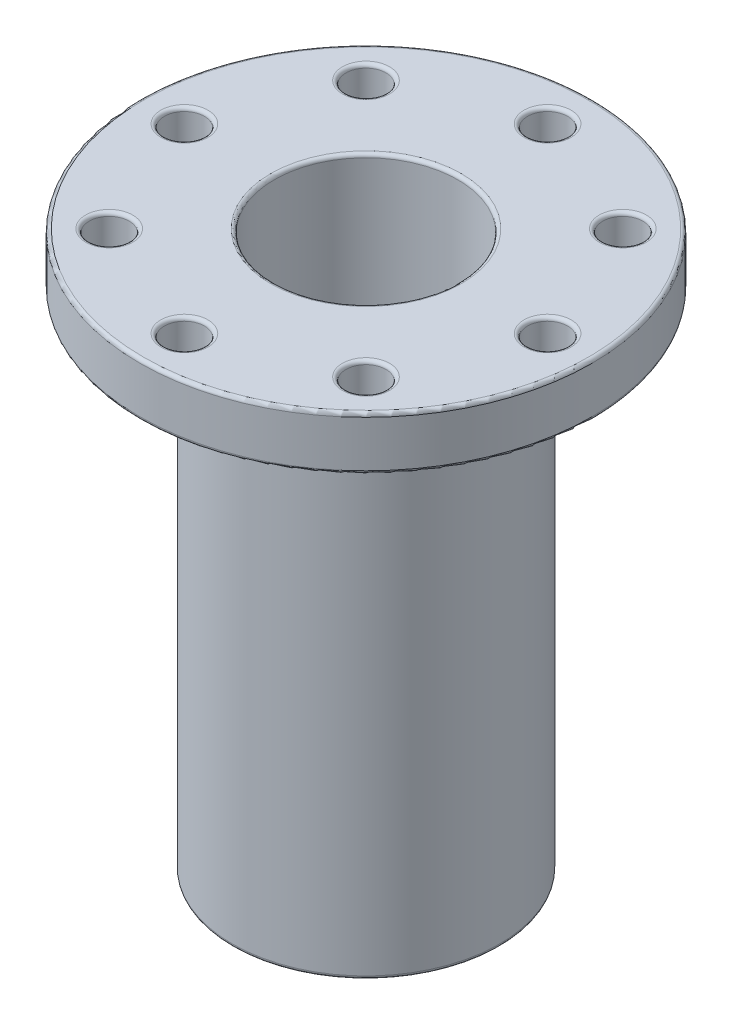
ISO-10303-21;
HEADER;
FILE_DESCRIPTION(('STEP AP214'),'2;1');
FILE_NAME('part.step','',(''),(''),'','','');
FILE_SCHEMA(('AUTOMOTIVE_DESIGN { 1 0 10303 214 1 1 1 1 }'));
ENDSEC;
DATA;
#1=APPLICATION_CONTEXT('core data for automotive mechanical design processes');
#2=APPLICATION_PROTOCOL_DEFINITION('international standard','automotive_design',2000,#1);
#3=PRODUCT_CONTEXT('',#1,'mechanical');
#4=PRODUCT('Part','Part','',(#3));
#5=PRODUCT_RELATED_PRODUCT_CATEGORY('part','',(#4));
#6=PRODUCT_DEFINITION_FORMATION('','',#4);
#7=PRODUCT_DEFINITION_CONTEXT('part definition',#1,'design');
#8=PRODUCT_DEFINITION('design','',#6,#7);
#9=PRODUCT_DEFINITION_SHAPE('','',#8);
#10=(LENGTH_UNIT() NAMED_UNIT(*) SI_UNIT(.MILLI.,.METRE.));
#11=(NAMED_UNIT(*) PLANE_ANGLE_UNIT() SI_UNIT($,.RADIAN.));
#12=(NAMED_UNIT(*) SI_UNIT($,.STERADIAN.) SOLID_ANGLE_UNIT());
#13=UNCERTAINTY_MEASURE_WITH_UNIT(LENGTH_MEASURE(1.E-05),#10,'distance_accuracy_value','');
#14=(GEOMETRIC_REPRESENTATION_CONTEXT(3) GLOBAL_UNCERTAINTY_ASSIGNED_CONTEXT((#13)) GLOBAL_UNIT_ASSIGNED_CONTEXT((#10,
#11,#12)) REPRESENTATION_CONTEXT('',''));
#15=CARTESIAN_POINT('',(0.,0.,0.));
#16=DIRECTION('',(0.,0.,1.));
#17=DIRECTION('',(1.,0.,0.));
#18=AXIS2_PLACEMENT_3D('',#15,#16,#17);
#19=CARTESIAN_POINT('',(0.,6.,0.));
#20=DIRECTION('',(0.,1.,0.));
#21=DIRECTION('',(0.,0.,1.));
#22=AXIS2_PLACEMENT_3D('',#19,#20,#21);
#23=PLANE('',#22);
#24=CARTESIAN_POINT('',(-14.4249783362056,6.,-14.4249783362056));
#25=DIRECTION('',(0.,1.,0.));
#26=DIRECTION('',(0.,0.,1.));
#27=AXIS2_PLACEMENT_3D('',#24,#25,#26);
#28=CIRCLE('',#27,2.65);
#29=CARTESIAN_POINT('',(-14.4249783362056,6.,-11.7749783362056));
#30=VERTEX_POINT('',#29);
#31=EDGE_CURVE('E155',#30,#30,#28,.F.);
#32=ORIENTED_EDGE('',*,*,#31,.T.);
#33=EDGE_LOOP('',(#32));
#34=FACE_BOUND('',#33,.T.);
#35=CARTESIAN_POINT('',(-14.4249783362056,6.,14.4249783362056));
#36=DIRECTION('',(0.,1.,0.));
#37=DIRECTION('',(0.,0.,1.));
#38=AXIS2_PLACEMENT_3D('',#35,#36,#37);
#39=CIRCLE('',#38,2.65);
#40=CARTESIAN_POINT('',(-14.4249783362056,6.,17.0749783362056));
#41=VERTEX_POINT('',#40);
#42=EDGE_CURVE('E158',#41,#41,#39,.F.);
#43=ORIENTED_EDGE('',*,*,#42,.T.);
#44=EDGE_LOOP('',(#43));
#45=FACE_BOUND('',#44,.T.);
#46=CARTESIAN_POINT('',(14.4249783362056,6.,14.4249783362056));
#47=DIRECTION('',(0.,1.,0.));
#48=DIRECTION('',(0.,0.,1.));
#49=AXIS2_PLACEMENT_3D('',#46,#47,#48);
#50=CIRCLE('',#49,2.65);
#51=CARTESIAN_POINT('',(14.4249783362056,6.,17.0749783362056));
#52=VERTEX_POINT('',#51);
#53=EDGE_CURVE('E161',#52,#52,#50,.F.);
#54=ORIENTED_EDGE('',*,*,#53,.T.);
#55=EDGE_LOOP('',(#54));
#56=FACE_BOUND('',#55,.T.);
#57=CARTESIAN_POINT('',(14.4249783362056,6.,-14.4249783362056));
#58=DIRECTION('',(0.,1.,0.));
#59=DIRECTION('',(0.,0.,1.));
#60=AXIS2_PLACEMENT_3D('',#57,#58,#59);
#61=CIRCLE('',#60,2.65);
#62=CARTESIAN_POINT('',(14.4249783362056,6.,-11.7749783362056));
#63=VERTEX_POINT('',#62);
#64=EDGE_CURVE('E164',#63,#63,#61,.F.);
#65=ORIENTED_EDGE('',*,*,#64,.T.);
#66=EDGE_LOOP('',(#65));
#67=FACE_BOUND('',#66,.T.);
#68=CARTESIAN_POINT('',(0.,6.,0.));
#69=DIRECTION('',(0.,1.,0.));
#70=DIRECTION('',(0.,0.,1.));
#71=AXIS2_PLACEMENT_3D('',#68,#69,#70);
#72=CIRCLE('',#71,25.);
#73=CARTESIAN_POINT('',(0.,6.,25.));
#74=VERTEX_POINT('',#73);
#75=EDGE_CURVE('E167',#74,#74,#72,.T.);
#76=ORIENTED_EDGE('',*,*,#75,.T.);
#77=EDGE_LOOP('',(#76));
#78=FACE_BOUND('',#77,.T.);
#79=CARTESIAN_POINT('',(0.,6.,-20.4));
#80=DIRECTION('',(0.,1.,0.));
#81=DIRECTION('',(0.,0.,1.));
#82=AXIS2_PLACEMENT_3D('',#79,#80,#81);
#83=CIRCLE('',#82,2.65);
#84=CARTESIAN_POINT('',(0.,6.,-17.75));
#85=VERTEX_POINT('',#84);
#86=EDGE_CURVE('E170',#85,#85,#83,.F.);
#87=ORIENTED_EDGE('',*,*,#86,.T.);
#88=EDGE_LOOP('',(#87));
#89=FACE_BOUND('',#88,.T.);
#90=CARTESIAN_POINT('',(20.4,6.,0.));
#91=DIRECTION('',(0.,1.,0.));
#92=DIRECTION('',(0.,0.,1.));
#93=AXIS2_PLACEMENT_3D('',#90,#91,#92);
#94=CIRCLE('',#93,2.65);
#95=CARTESIAN_POINT('',(20.4,6.,2.65));
#96=VERTEX_POINT('',#95);
#97=EDGE_CURVE('E173',#96,#96,#94,.F.);
#98=ORIENTED_EDGE('',*,*,#97,.T.);
#99=EDGE_LOOP('',(#98));
#100=FACE_BOUND('',#99,.T.);
#101=CARTESIAN_POINT('',(0.,6.,20.4));
#102=DIRECTION('',(0.,1.,0.));
#103=DIRECTION('',(0.,0.,1.));
#104=AXIS2_PLACEMENT_3D('',#101,#102,#103);
#105=CIRCLE('',#104,2.65);
#106=CARTESIAN_POINT('',(0.,6.,23.05));
#107=VERTEX_POINT('',#106);
#108=EDGE_CURVE('E176',#107,#107,#105,.F.);
#109=ORIENTED_EDGE('',*,*,#108,.T.);
#110=EDGE_LOOP('',(#109));
#111=FACE_BOUND('',#110,.T.);
#112=CARTESIAN_POINT('',(-20.4,6.,0.));
#113=DIRECTION('',(0.,1.,0.));
#114=DIRECTION('',(0.,0.,1.));
#115=AXIS2_PLACEMENT_3D('',#112,#113,#114);
#116=CIRCLE('',#115,2.65);
#117=CARTESIAN_POINT('',(-20.4,6.,2.65));
#118=VERTEX_POINT('',#117);
#119=EDGE_CURVE('E179',#118,#118,#116,.F.);
#120=ORIENTED_EDGE('',*,*,#119,.T.);
#121=EDGE_LOOP('',(#120));
#122=FACE_BOUND('',#121,.T.);
#123=CARTESIAN_POINT('',(0.,6.,0.));
#124=DIRECTION('',(0.,1.,0.));
#125=DIRECTION('',(0.,0.,1.));
#126=AXIS2_PLACEMENT_3D('',#123,#124,#125);
#127=CIRCLE('',#126,10.7125);
#128=CARTESIAN_POINT('',(0.,6.,10.7125));
#129=VERTEX_POINT('',#128);
#130=EDGE_CURVE('E182',#129,#129,#127,.F.);
#131=ORIENTED_EDGE('',*,*,#130,.T.);
#132=EDGE_LOOP('',(#131));
#133=FACE_BOUND('',#132,.T.);
#134=ADVANCED_FACE('F39',(#34,#45,#56,#67,#78,#89,#100,#111,#122,#133),#23,.T.);
#135=CARTESIAN_POINT('',(0.,0.,0.));
#136=DIRECTION('',(0.,1.,0.));
#137=DIRECTION('',(0.,0.,1.));
#138=AXIS2_PLACEMENT_3D('',#135,#136,#137);
#139=PLANE('',#138);
#140=CARTESIAN_POINT('',(-14.4249783362056,0.,-14.4249783362056));
#141=DIRECTION('',(0.,1.,0.));
#142=DIRECTION('',(0.,0.,1.));
#143=AXIS2_PLACEMENT_3D('',#140,#141,#142);
#144=CIRCLE('',#143,2.65);
#145=CARTESIAN_POINT('',(-14.4249783362056,0.,-11.7749783362056));
#146=VERTEX_POINT('',#145);
#147=EDGE_CURVE('E77',#146,#146,#144,.T.);
#148=ORIENTED_EDGE('',*,*,#147,.T.);
#149=EDGE_LOOP('',(#148));
#150=FACE_BOUND('',#149,.T.);
#151=CARTESIAN_POINT('',(-20.4,0.,0.));
#152=DIRECTION('',(0.,1.,0.));
#153=DIRECTION('',(0.,0.,1.));
#154=AXIS2_PLACEMENT_3D('',#151,#152,#153);
#155=CIRCLE('',#154,2.65);
#156=CARTESIAN_POINT('',(-20.4,0.,2.65));
#157=VERTEX_POINT('',#156);
#158=EDGE_CURVE('E80',#157,#157,#155,.T.);
#159=ORIENTED_EDGE('',*,*,#158,.T.);
#160=EDGE_LOOP('',(#159));
#161=FACE_BOUND('',#160,.T.);
#162=CARTESIAN_POINT('',(-14.4249783362056,0.,14.4249783362056));
#163=DIRECTION('',(0.,1.,0.));
#164=DIRECTION('',(0.,0.,1.));
#165=AXIS2_PLACEMENT_3D('',#162,#163,#164);
#166=CIRCLE('',#165,2.65);
#167=CARTESIAN_POINT('',(-14.4249783362056,0.,17.0749783362056));
#168=VERTEX_POINT('',#167);
#169=EDGE_CURVE('E83',#168,#168,#166,.T.);
#170=ORIENTED_EDGE('',*,*,#169,.T.);
#171=EDGE_LOOP('',(#170));
#172=FACE_BOUND('',#171,.T.);
#173=CARTESIAN_POINT('',(0.,0.,20.4));
#174=DIRECTION('',(0.,1.,0.));
#175=DIRECTION('',(0.,0.,1.));
#176=AXIS2_PLACEMENT_3D('',#173,#174,#175);
#177=CIRCLE('',#176,2.65);
#178=CARTESIAN_POINT('',(0.,0.,23.05));
#179=VERTEX_POINT('',#178);
#180=EDGE_CURVE('E86',#179,#179,#177,.T.);
#181=ORIENTED_EDGE('',*,*,#180,.T.);
#182=EDGE_LOOP('',(#181));
#183=FACE_BOUND('',#182,.T.);
#184=CARTESIAN_POINT('',(14.4249783362056,0.,14.4249783362056));
#185=DIRECTION('',(0.,1.,0.));
#186=DIRECTION('',(0.,0.,1.));
#187=AXIS2_PLACEMENT_3D('',#184,#185,#186);
#188=CIRCLE('',#187,2.65);
#189=CARTESIAN_POINT('',(14.4249783362056,0.,17.0749783362056));
#190=VERTEX_POINT('',#189);
#191=EDGE_CURVE('E89',#190,#190,#188,.T.);
#192=ORIENTED_EDGE('',*,*,#191,.T.);
#193=EDGE_LOOP('',(#192));
#194=FACE_BOUND('',#193,.T.);
#195=CARTESIAN_POINT('',(20.4,0.,0.));
#196=DIRECTION('',(0.,1.,0.));
#197=DIRECTION('',(0.,0.,1.));
#198=AXIS2_PLACEMENT_3D('',#195,#196,#197);
#199=CIRCLE('',#198,2.65);
#200=CARTESIAN_POINT('',(20.4,0.,2.65));
#201=VERTEX_POINT('',#200);
#202=EDGE_CURVE('E92',#201,#201,#199,.T.);
#203=ORIENTED_EDGE('',*,*,#202,.T.);
#204=EDGE_LOOP('',(#203));
#205=FACE_BOUND('',#204,.T.);
#206=CARTESIAN_POINT('',(14.4249783362056,0.,-14.4249783362056));
#207=DIRECTION('',(0.,1.,0.));
#208=DIRECTION('',(0.,0.,1.));
#209=AXIS2_PLACEMENT_3D('',#206,#207,#208);
#210=CIRCLE('',#209,2.65);
#211=CARTESIAN_POINT('',(14.4249783362056,0.,-11.7749783362056));
#212=VERTEX_POINT('',#211);
#213=EDGE_CURVE('E95',#212,#212,#210,.T.);
#214=ORIENTED_EDGE('',*,*,#213,.T.);
#215=EDGE_LOOP('',(#214));
#216=FACE_BOUND('',#215,.T.);
#217=CARTESIAN_POINT('',(0.,0.,-20.4));
#218=DIRECTION('',(0.,1.,0.));
#219=DIRECTION('',(0.,0.,1.));
#220=AXIS2_PLACEMENT_3D('',#217,#218,#219);
#221=CIRCLE('',#220,2.65);
#222=CARTESIAN_POINT('',(0.,0.,-17.75));
#223=VERTEX_POINT('',#222);
#224=EDGE_CURVE('E98',#223,#223,#221,.T.);
#225=ORIENTED_EDGE('',*,*,#224,.T.);
#226=EDGE_LOOP('',(#225));
#227=FACE_BOUND('',#226,.T.);
#228=CARTESIAN_POINT('',(0.,0.,0.));
#229=DIRECTION('',(0.,1.,0.));
#230=DIRECTION('',(0.,0.,1.));
#231=AXIS2_PLACEMENT_3D('',#228,#229,#230);
#232=CIRCLE('',#231,25.);
#233=CARTESIAN_POINT('',(0.,0.,25.));
#234=VERTEX_POINT('',#233);
#235=EDGE_CURVE('E101',#234,#234,#232,.F.);
#236=ORIENTED_EDGE('',*,*,#235,.T.);
#237=EDGE_LOOP('',(#236));
#238=FACE_BOUND('',#237,.T.);
#239=CARTESIAN_POINT('',(0.,0.,0.));
#240=DIRECTION('',(0.,1.,0.));
#241=DIRECTION('',(0.,0.,1.));
#242=AXIS2_PLACEMENT_3D('',#239,#240,#241);
#243=CIRCLE('',#242,15.4);
#244=CARTESIAN_POINT('',(0.,0.,15.4));
#245=VERTEX_POINT('',#244);
#246=EDGE_CURVE('E104',#245,#245,#243,.T.);
#247=ORIENTED_EDGE('',*,*,#246,.T.);
#248=EDGE_LOOP('',(#247));
#249=FACE_BOUND('',#248,.T.);
#250=ADVANCED_FACE('F202',(#150,#161,#172,#183,#194,#205,#216,#227,#238,#249),#139,.F.);
#251=CARTESIAN_POINT('',(0.,6.,0.));
#252=DIRECTION('',(0.,-1.,0.));
#253=DIRECTION('',(0.,0.,-1.));
#254=AXIS2_PLACEMENT_3D('',#251,#252,#253);
#255=CYLINDRICAL_SURFACE('',#254,25.4);
#256=CARTESIAN_POINT('',(0.,5.6,0.));
#257=DIRECTION('',(0.,1.,0.));
#258=DIRECTION('',(0.,0.,1.));
#259=AXIS2_PLACEMENT_3D('',#256,#257,#258);
#260=CIRCLE('',#259,25.4);
#261=CARTESIAN_POINT('',(0.,5.6,25.4));
#262=VERTEX_POINT('',#261);
#263=EDGE_CURVE('E131',#262,#262,#260,.F.);
#264=ORIENTED_EDGE('',*,*,#263,.T.);
#265=EDGE_LOOP('',(#264));
#266=FACE_BOUND('',#265,.T.);
#267=CARTESIAN_POINT('',(0.,0.4,0.));
#268=DIRECTION('',(0.,1.,0.));
#269=DIRECTION('',(0.,0.,1.));
#270=AXIS2_PLACEMENT_3D('',#267,#268,#269);
#271=CIRCLE('',#270,25.4);
#272=CARTESIAN_POINT('',(0.,0.4,25.4));
#273=VERTEX_POINT('',#272);
#274=EDGE_CURVE('E134',#273,#273,#271,.T.);
#275=ORIENTED_EDGE('',*,*,#274,.T.);
#276=EDGE_LOOP('',(#275));
#277=FACE_BOUND('',#276,.T.);
#278=ADVANCED_FACE('F205',(#266,#277),#255,.T.);
#279=CARTESIAN_POINT('',(0.,6.,-20.4));
#280=DIRECTION('',(0.,-1.,0.));
#281=DIRECTION('',(0.,0.,-1.));
#282=AXIS2_PLACEMENT_3D('',#279,#280,#281);
#283=CYLINDRICAL_SURFACE('',#282,2.25);
#284=CARTESIAN_POINT('',(0.,5.6,-20.4));
#285=DIRECTION('',(0.,1.,0.));
#286=DIRECTION('',(0.,0.,1.));
#287=AXIS2_PLACEMENT_3D('',#284,#285,#286);
#288=CIRCLE('',#287,2.25);
#289=CARTESIAN_POINT('',(0.,5.6,-18.15));
#290=VERTEX_POINT('',#289);
#291=EDGE_CURVE('E125',#290,#290,#288,.T.);
#292=ORIENTED_EDGE('',*,*,#291,.T.);
#293=EDGE_LOOP('',(#292));
#294=FACE_BOUND('',#293,.T.);
#295=CARTESIAN_POINT('',(0.,0.4,-20.4));
#296=DIRECTION('',(0.,1.,0.));
#297=DIRECTION('',(0.,0.,1.));
#298=AXIS2_PLACEMENT_3D('',#295,#296,#297);
#299=CIRCLE('',#298,2.25);
#300=CARTESIAN_POINT('',(0.,0.4,-18.15));
#301=VERTEX_POINT('',#300);
#302=EDGE_CURVE('E128',#301,#301,#299,.F.);
#303=ORIENTED_EDGE('',*,*,#302,.T.);
#304=EDGE_LOOP('',(#303));
#305=FACE_BOUND('',#304,.T.);
#306=ADVANCED_FACE('F249',(#294,#305),#283,.F.);
#307=CARTESIAN_POINT('',(14.4249783362056,6.,-14.4249783362056));
#308=DIRECTION('',(0.,-1.,0.));
#309=DIRECTION('',(0.,0.,-1.));
#310=AXIS2_PLACEMENT_3D('',#307,#308,#309);
#311=CYLINDRICAL_SURFACE('',#310,2.25);
#312=CARTESIAN_POINT('',(14.4249783362056,5.6,-14.4249783362056));
#313=DIRECTION('',(0.,1.,0.));
#314=DIRECTION('',(0.,0.,1.));
#315=AXIS2_PLACEMENT_3D('',#312,#313,#314);
#316=CIRCLE('',#315,2.25);
#317=CARTESIAN_POINT('',(14.4249783362056,5.6,-12.1749783362056));
#318=VERTEX_POINT('',#317);
#319=EDGE_CURVE('E137',#318,#318,#316,.T.);
#320=ORIENTED_EDGE('',*,*,#319,.T.);
#321=EDGE_LOOP('',(#320));
#322=FACE_BOUND('',#321,.T.);
#323=CARTESIAN_POINT('',(14.4249783362056,0.4,-14.4249783362056));
#324=DIRECTION('',(0.,1.,0.));
#325=DIRECTION('',(0.,0.,1.));
#326=AXIS2_PLACEMENT_3D('',#323,#324,#325);
#327=CIRCLE('',#326,2.25);
#328=CARTESIAN_POINT('',(14.4249783362056,0.4,-12.1749783362056));
#329=VERTEX_POINT('',#328);
#330=EDGE_CURVE('E140',#329,#329,#327,.F.);
#331=ORIENTED_EDGE('',*,*,#330,.T.);
#332=EDGE_LOOP('',(#331));
#333=FACE_BOUND('',#332,.T.);
#334=ADVANCED_FACE('F322',(#322,#333),#311,.F.);
#335=CARTESIAN_POINT('',(20.4,6.,0.));
#336=DIRECTION('',(0.,-1.,0.));
#337=DIRECTION('',(0.,0.,-1.));
#338=AXIS2_PLACEMENT_3D('',#335,#336,#337);
#339=CYLINDRICAL_SURFACE('',#338,2.25);
#340=CARTESIAN_POINT('',(20.4,5.6,0.));
#341=DIRECTION('',(0.,1.,0.));
#342=DIRECTION('',(0.,0.,1.));
#343=AXIS2_PLACEMENT_3D('',#340,#341,#342);
#344=CIRCLE('',#343,2.25);
#345=CARTESIAN_POINT('',(20.4,5.6,2.25));
#346=VERTEX_POINT('',#345);
#347=EDGE_CURVE('E119',#346,#346,#344,.T.);
#348=ORIENTED_EDGE('',*,*,#347,.T.);
#349=EDGE_LOOP('',(#348));
#350=FACE_BOUND('',#349,.T.);
#351=CARTESIAN_POINT('',(20.4,0.4,0.));
#352=DIRECTION('',(0.,1.,0.));
#353=DIRECTION('',(0.,0.,1.));
#354=AXIS2_PLACEMENT_3D('',#351,#352,#353);
#355=CIRCLE('',#354,2.25);
#356=CARTESIAN_POINT('',(20.4,0.4,2.25));
#357=VERTEX_POINT('',#356);
#358=EDGE_CURVE('E122',#357,#357,#355,.F.);
#359=ORIENTED_EDGE('',*,*,#358,.T.);
#360=EDGE_LOOP('',(#359));
#361=FACE_BOUND('',#360,.T.);
#362=ADVANCED_FACE('F327',(#350,#361),#339,.F.);
#363=CARTESIAN_POINT('',(14.4249783362056,6.,14.4249783362056));
#364=DIRECTION('',(0.,-1.,0.));
#365=DIRECTION('',(0.,0.,-1.));
#366=AXIS2_PLACEMENT_3D('',#363,#364,#365);
#367=CYLINDRICAL_SURFACE('',#366,2.25);
#368=CARTESIAN_POINT('',(14.4249783362056,5.6,14.4249783362056));
#369=DIRECTION('',(0.,1.,0.));
#370=DIRECTION('',(0.,0.,1.));
#371=AXIS2_PLACEMENT_3D('',#368,#369,#370);
#372=CIRCLE('',#371,2.25);
#373=CARTESIAN_POINT('',(14.4249783362056,5.6,16.6749783362056));
#374=VERTEX_POINT('',#373);
#375=EDGE_CURVE('E143',#374,#374,#372,.T.);
#376=ORIENTED_EDGE('',*,*,#375,.T.);
#377=EDGE_LOOP('',(#376));
#378=FACE_BOUND('',#377,.T.);
#379=CARTESIAN_POINT('',(14.4249783362056,0.4,14.4249783362056));
#380=DIRECTION('',(0.,1.,0.));
#381=DIRECTION('',(0.,0.,1.));
#382=AXIS2_PLACEMENT_3D('',#379,#380,#381);
#383=CIRCLE('',#382,2.25);
#384=CARTESIAN_POINT('',(14.4249783362056,0.4,16.6749783362056));
#385=VERTEX_POINT('',#384);
#386=EDGE_CURVE('E146',#385,#385,#383,.F.);
#387=ORIENTED_EDGE('',*,*,#386,.T.);
#388=EDGE_LOOP('',(#387));
#389=FACE_BOUND('',#388,.T.);
#390=ADVANCED_FACE('F334',(#378,#389),#367,.F.);
#391=CARTESIAN_POINT('',(0.,6.,20.4));
#392=DIRECTION('',(0.,-1.,0.));
#393=DIRECTION('',(0.,0.,-1.));
#394=AXIS2_PLACEMENT_3D('',#391,#392,#393);
#395=CYLINDRICAL_SURFACE('',#394,2.25);
#396=CARTESIAN_POINT('',(0.,5.6,20.4));
#397=DIRECTION('',(0.,1.,0.));
#398=DIRECTION('',(0.,0.,1.));
#399=AXIS2_PLACEMENT_3D('',#396,#397,#398);
#400=CIRCLE('',#399,2.25);
#401=CARTESIAN_POINT('',(0.,5.6,22.65));
#402=VERTEX_POINT('',#401);
#403=EDGE_CURVE('E113',#402,#402,#400,.T.);
#404=ORIENTED_EDGE('',*,*,#403,.T.);
#405=EDGE_LOOP('',(#404));
#406=FACE_BOUND('',#405,.T.);
#407=CARTESIAN_POINT('',(0.,0.4,20.4));
#408=DIRECTION('',(0.,1.,0.));
#409=DIRECTION('',(0.,0.,1.));
#410=AXIS2_PLACEMENT_3D('',#407,#408,#409);
#411=CIRCLE('',#410,2.25);
#412=CARTESIAN_POINT('',(0.,0.4,22.65));
#413=VERTEX_POINT('',#412);
#414=EDGE_CURVE('E116',#413,#413,#411,.F.);
#415=ORIENTED_EDGE('',*,*,#414,.T.);
#416=EDGE_LOOP('',(#415));
#417=FACE_BOUND('',#416,.T.);
#418=ADVANCED_FACE('F341',(#406,#417),#395,.F.);
#419=CARTESIAN_POINT('',(-14.4249783362056,6.,14.4249783362056));
#420=DIRECTION('',(0.,-1.,0.));
#421=DIRECTION('',(0.,0.,-1.));
#422=AXIS2_PLACEMENT_3D('',#419,#420,#421);
#423=CYLINDRICAL_SURFACE('',#422,2.25);
#424=CARTESIAN_POINT('',(-14.4249783362056,5.6,14.4249783362056));
#425=DIRECTION('',(0.,1.,0.));
#426=DIRECTION('',(0.,0.,1.));
#427=AXIS2_PLACEMENT_3D('',#424,#425,#426);
#428=CIRCLE('',#427,2.25);
#429=CARTESIAN_POINT('',(-14.4249783362056,5.6,16.6749783362056));
#430=VERTEX_POINT('',#429);
#431=EDGE_CURVE('E149',#430,#430,#428,.T.);
#432=ORIENTED_EDGE('',*,*,#431,.T.);
#433=EDGE_LOOP('',(#432));
#434=FACE_BOUND('',#433,.T.);
#435=CARTESIAN_POINT('',(-14.4249783362056,0.4,14.4249783362056));
#436=DIRECTION('',(0.,1.,0.));
#437=DIRECTION('',(0.,0.,1.));
#438=AXIS2_PLACEMENT_3D('',#435,#436,#437);
#439=CIRCLE('',#438,2.25);
#440=CARTESIAN_POINT('',(-14.4249783362056,0.4,16.6749783362056));
#441=VERTEX_POINT('',#440);
#442=EDGE_CURVE('E152',#441,#441,#439,.F.);
#443=ORIENTED_EDGE('',*,*,#442,.T.);
#444=EDGE_LOOP('',(#443));
#445=FACE_BOUND('',#444,.T.);
#446=ADVANCED_FACE('F345',(#434,#445),#423,.F.);
#447=CARTESIAN_POINT('',(-20.4,6.,0.));
#448=DIRECTION('',(0.,-1.,0.));
#449=DIRECTION('',(0.,0.,-1.));
#450=AXIS2_PLACEMENT_3D('',#447,#448,#449);
#451=CYLINDRICAL_SURFACE('',#450,2.25);
#452=CARTESIAN_POINT('',(-20.4,5.6,0.));
#453=DIRECTION('',(0.,1.,0.));
#454=DIRECTION('',(0.,0.,1.));
#455=AXIS2_PLACEMENT_3D('',#452,#453,#454);
#456=CIRCLE('',#455,2.25);
#457=CARTESIAN_POINT('',(-20.4,5.6,2.25));
#458=VERTEX_POINT('',#457);
#459=EDGE_CURVE('E107',#458,#458,#456,.T.);
#460=ORIENTED_EDGE('',*,*,#459,.T.);
#461=EDGE_LOOP('',(#460));
#462=FACE_BOUND('',#461,.T.);
#463=CARTESIAN_POINT('',(-20.4,0.4,0.));
#464=DIRECTION('',(0.,1.,0.));
#465=DIRECTION('',(0.,0.,1.));
#466=AXIS2_PLACEMENT_3D('',#463,#464,#465);
#467=CIRCLE('',#466,2.25);
#468=CARTESIAN_POINT('',(-20.4,0.4,2.25));
#469=VERTEX_POINT('',#468);
#470=EDGE_CURVE('E110',#469,#469,#467,.F.);
#471=ORIENTED_EDGE('',*,*,#470,.T.);
#472=EDGE_LOOP('',(#471));
#473=FACE_BOUND('',#472,.T.);
#474=ADVANCED_FACE('F349',(#462,#473),#451,.F.);
#475=CARTESIAN_POINT('',(-14.4249783362056,6.,-14.4249783362056));
#476=DIRECTION('',(0.,-1.,0.));
#477=DIRECTION('',(0.,0.,-1.));
#478=AXIS2_PLACEMENT_3D('',#475,#476,#477);
#479=CYLINDRICAL_SURFACE('',#478,2.25);
#480=CARTESIAN_POINT('',(-14.4249783362056,5.6,-14.4249783362056));
#481=DIRECTION('',(0.,1.,0.));
#482=DIRECTION('',(0.,0.,1.));
#483=AXIS2_PLACEMENT_3D('',#480,#481,#482);
#484=CIRCLE('',#483,2.25);
#485=CARTESIAN_POINT('',(-14.4249783362056,5.6,-12.1749783362056));
#486=VERTEX_POINT('',#485);
#487=EDGE_CURVE('E185',#486,#486,#484,.T.);
#488=ORIENTED_EDGE('',*,*,#487,.T.);
#489=EDGE_LOOP('',(#488));
#490=FACE_BOUND('',#489,.T.);
#491=CARTESIAN_POINT('',(-14.4249783362056,0.4,-14.4249783362056));
#492=DIRECTION('',(0.,1.,0.));
#493=DIRECTION('',(0.,0.,1.));
#494=AXIS2_PLACEMENT_3D('',#491,#492,#493);
#495=CIRCLE('',#494,2.25);
#496=CARTESIAN_POINT('',(-14.4249783362056,0.4,-12.1749783362056));
#497=VERTEX_POINT('',#496);
#498=EDGE_CURVE('E188',#497,#497,#495,.F.);
#499=ORIENTED_EDGE('',*,*,#498,.T.);
#500=EDGE_LOOP('',(#499));
#501=FACE_BOUND('',#500,.T.);
#502=ADVANCED_FACE('F192',(#490,#501),#479,.F.);
#503=CARTESIAN_POINT('',(0.,-56.5,0.));
#504=DIRECTION('',(0.,1.,0.));
#505=DIRECTION('',(0.,0.,1.));
#506=AXIS2_PLACEMENT_3D('',#503,#504,#505);
#507=CYLINDRICAL_SURFACE('',#506,15.);
#508=CARTESIAN_POINT('',(0.,-0.399999999999998,0.));
#509=DIRECTION('',(0.,1.,0.));
#510=DIRECTION('',(0.,0.,1.));
#511=AXIS2_PLACEMENT_3D('',#508,#509,#510);
#512=CIRCLE('',#511,15.);
#513=CARTESIAN_POINT('',(0.,-0.399999999999998,15.));
#514=VERTEX_POINT('',#513);
#515=EDGE_CURVE('E71',#514,#514,#512,.F.);
#516=ORIENTED_EDGE('',*,*,#515,.T.);
#517=EDGE_LOOP('',(#516));
#518=FACE_BOUND('',#517,.T.);
#519=CARTESIAN_POINT('',(0.,-56.1,0.));
#520=DIRECTION('',(0.,1.,0.));
#521=DIRECTION('',(0.,0.,1.));
#522=AXIS2_PLACEMENT_3D('',#519,#520,#521);
#523=CIRCLE('',#522,15.);
#524=CARTESIAN_POINT('',(0.,-56.1,15.));
#525=VERTEX_POINT('',#524);
#526=EDGE_CURVE('E74',#525,#525,#523,.T.);
#527=ORIENTED_EDGE('',*,*,#526,.T.);
#528=EDGE_LOOP('',(#527));
#529=FACE_BOUND('',#528,.T.);
#530=ADVANCED_FACE('F356',(#518,#529),#507,.T.);
#531=CARTESIAN_POINT('',(0.,-56.5,0.));
#532=DIRECTION('',(0.,1.,0.));
#533=DIRECTION('',(0.,0.,1.));
#534=AXIS2_PLACEMENT_3D('',#531,#532,#533);
#535=PLANE('',#534);
#536=CARTESIAN_POINT('',(0.,-56.5,0.));
#537=DIRECTION('',(0.,1.,0.));
#538=DIRECTION('',(0.,0.,1.));
#539=AXIS2_PLACEMENT_3D('',#536,#537,#538);
#540=CIRCLE('',#539,14.6);
#541=CARTESIAN_POINT('',(0.,-56.5,14.6));
#542=VERTEX_POINT('',#541);
#543=EDGE_CURVE('E65',#542,#542,#540,.F.);
#544=ORIENTED_EDGE('',*,*,#543,.T.);
#545=EDGE_LOOP('',(#544));
#546=FACE_BOUND('',#545,.T.);
#547=CARTESIAN_POINT('',(0.,-56.5,0.));
#548=DIRECTION('',(0.,1.,0.));
#549=DIRECTION('',(0.,0.,1.));
#550=AXIS2_PLACEMENT_3D('',#547,#548,#549);
#551=CIRCLE('',#550,7.47);
#552=CARTESIAN_POINT('',(0.,-56.5,7.47));
#553=VERTEX_POINT('',#552);
#554=EDGE_CURVE('E68',#553,#553,#551,.T.);
#555=ORIENTED_EDGE('',*,*,#554,.T.);
#556=EDGE_LOOP('',(#555));
#557=FACE_BOUND('',#556,.T.);
#558=ADVANCED_FACE('F360',(#546,#557),#535,.F.);
#559=CARTESIAN_POINT('',(0.,-32.1,0.));
#560=DIRECTION('',(0.,1.,0.));
#561=DIRECTION('',(0.,0.,1.));
#562=AXIS2_PLACEMENT_3D('',#559,#560,#561);
#563=CYLINDRICAL_SURFACE('',#562,10.3125);
#564=CARTESIAN_POINT('',(0.,5.6,0.));
#565=DIRECTION('',(0.,1.,0.));
#566=DIRECTION('',(0.,0.,1.));
#567=AXIS2_PLACEMENT_3D('',#564,#565,#566);
#568=CIRCLE('',#567,10.3125);
#569=CARTESIAN_POINT('',(0.,5.6,10.3125));
#570=VERTEX_POINT('',#569);
#571=EDGE_CURVE('E10',#570,#570,#568,.T.);
#572=CARTESIAN_POINT('',(0.,-31.7,0.));
#573=DIRECTION('',(0.,1.,0.));
#574=DIRECTION('',(0.,0.,1.));
#575=AXIS2_PLACEMENT_3D('',#572,#573,#574);
#576=CIRCLE('',#575,10.3125);
#577=CARTESIAN_POINT('',(0.,-31.7,10.3125));
#578=VERTEX_POINT('',#577);
#579=EDGE_CURVE('E46',#578,#578,#576,.F.);
#580=CARTESIAN_POINT('',(0.,5.6,10.3125));
#581=CARTESIAN_POINT('',(0.,5.21145833333333,10.3125));
#582=CARTESIAN_POINT('',(0.,4.82291666666667,10.3125));
#583=CARTESIAN_POINT('',(0.,4.04583333333333,10.3125));
#584=CARTESIAN_POINT('',(0.,3.65729166666667,10.3125));
#585=CARTESIAN_POINT('',(0.,2.88020833333333,10.3125));
#586=CARTESIAN_POINT('',(0.,2.49166666666666,10.3125));
#587=CARTESIAN_POINT('',(0.,1.71458333333333,10.3125));
#588=CARTESIAN_POINT('',(0.,1.32604166666667,10.3125));
#589=CARTESIAN_POINT('',(0.,0.548958333333333,10.3125));
#590=CARTESIAN_POINT('',(0.,0.160416666666665,10.3125));
#591=CARTESIAN_POINT('',(0.,-0.616666666666668,10.3125));
#592=CARTESIAN_POINT('',(0.,-1.00520833333333,10.3125));
#593=CARTESIAN_POINT('',(0.,-1.78229166666667,10.3125));
#594=CARTESIAN_POINT('',(0.,-2.17083333333333,10.3125));
#595=CARTESIAN_POINT('',(0.,-2.94791666666667,10.3125));
#596=CARTESIAN_POINT('',(0.,-3.33645833333333,10.3125));
#597=CARTESIAN_POINT('',(0.,-4.11354166666667,10.3125));
#598=CARTESIAN_POINT('',(0.,-4.50208333333333,10.3125));
#599=CARTESIAN_POINT('',(0.,-5.27916666666667,10.3125));
#600=CARTESIAN_POINT('',(0.,-5.66770833333333,10.3125));
#601=CARTESIAN_POINT('',(0.,-6.44479166666667,10.3125));
#602=CARTESIAN_POINT('',(0.,-6.83333333333333,10.3125));
#603=CARTESIAN_POINT('',(0.,-7.61041666666667,10.3125));
#604=CARTESIAN_POINT('',(0.,-7.99895833333334,10.3125));
#605=CARTESIAN_POINT('',(0.,-8.77604166666667,10.3125));
#606=CARTESIAN_POINT('',(0.,-9.16458333333333,10.3125));
#607=CARTESIAN_POINT('',(0.,-9.94166666666667,10.3125));
#608=CARTESIAN_POINT('',(0.,-10.3302083333333,10.3125));
#609=CARTESIAN_POINT('',(0.,-11.1072916666667,10.3125));
#610=CARTESIAN_POINT('',(0.,-11.4958333333333,10.3125));
#611=CARTESIAN_POINT('',(0.,-12.2729166666667,10.3125));
#612=CARTESIAN_POINT('',(0.,-12.6614583333333,10.3125));
#613=CARTESIAN_POINT('',(0.,-13.4385416666667,10.3125));
#614=CARTESIAN_POINT('',(0.,-13.8270833333333,10.3125));
#615=CARTESIAN_POINT('',(0.,-14.6041666666667,10.3125));
#616=CARTESIAN_POINT('',(0.,-14.9927083333333,10.3125));
#617=CARTESIAN_POINT('',(0.,-15.7697916666667,10.3125));
#618=CARTESIAN_POINT('',(0.,-16.1583333333333,10.3125));
#619=CARTESIAN_POINT('',(0.,-16.9354166666667,10.3125));
#620=CARTESIAN_POINT('',(0.,-17.3239583333333,10.3125));
#621=CARTESIAN_POINT('',(0.,-18.1010416666667,10.3125));
#622=CARTESIAN_POINT('',(0.,-18.4895833333333,10.3125));
#623=CARTESIAN_POINT('',(0.,-19.2666666666667,10.3125));
#624=CARTESIAN_POINT('',(0.,-19.6552083333333,10.3125));
#625=CARTESIAN_POINT('',(0.,-20.4322916666667,10.3125));
#626=CARTESIAN_POINT('',(0.,-20.8208333333333,10.3125));
#627=CARTESIAN_POINT('',(0.,-21.5979166666667,10.3125));
#628=CARTESIAN_POINT('',(0.,-21.9864583333333,10.3125));
#629=CARTESIAN_POINT('',(0.,-22.7635416666667,10.3125));
#630=CARTESIAN_POINT('',(0.,-23.1520833333333,10.3125));
#631=CARTESIAN_POINT('',(0.,-23.9291666666667,10.3125));
#632=CARTESIAN_POINT('',(0.,-24.3177083333333,10.3125));
#633=CARTESIAN_POINT('',(0.,-25.0947916666667,10.3125));
#634=CARTESIAN_POINT('',(0.,-25.4833333333333,10.3125));
#635=CARTESIAN_POINT('',(0.,-26.2604166666667,10.3125));
#636=CARTESIAN_POINT('',(0.,-26.6489583333333,10.3125));
#637=CARTESIAN_POINT('',(0.,-27.4260416666667,10.3125));
#638=CARTESIAN_POINT('',(0.,-27.8145833333333,10.3125));
#639=CARTESIAN_POINT('',(0.,-28.5916666666667,10.3125));
#640=CARTESIAN_POINT('',(0.,-28.9802083333333,10.3125));
#641=CARTESIAN_POINT('',(0.,-29.7572916666667,10.3125));
#642=CARTESIAN_POINT('',(0.,-30.1458333333333,10.3125));
#643=CARTESIAN_POINT('',(0.,-30.9229166666667,10.3125));
#644=CARTESIAN_POINT('',(0.,-31.3114583333333,10.3125));
#645=CARTESIAN_POINT('',(0.,-31.7,10.3125));
#646=B_SPLINE_CURVE_WITH_KNOTS('',3,(#580,#581,#582,#583,#584,#585,#586,#587,#588,#589,#590,
#591,#592,#593,#594,#595,#596,#597,#598,#599,#600,#601,#602,#603,#604,#605,#606,#607,#608,#609,
#610,#611,#612,#613,#614,#615,#616,#617,#618,#619,#620,#621,#622,#623,#624,#625,#626,#627,#628,
#629,#630,#631,#632,#633,#634,#635,#636,#637,#638,#639,#640,#641,#642,#643,#644,#645),
.UNSPECIFIED.,.F.,.F.,(4,2,2,2,2,2,2,2,2,2,2,2,2,2,2,2,2,2,2,2,2,2,2,2,2,2,2,2,2,2,2,2,4),(0.,
1.165625,2.33125,3.496875,4.6625,5.828125,6.99375,8.159375,9.325,10.490625,11.65625,12.821875,
13.9875,15.153125,16.31875,17.484375,18.65,19.815625,20.98125,22.146875,23.3125,24.478125,
25.64375,26.809375,27.975,29.140625,30.30625,31.471875,32.6375,33.803125,34.96875,36.134375,
37.3),.UNSPECIFIED.);
#647=EDGE_CURVE('BSEAM364',#570,#578,#646,.T.);
#648=ORIENTED_EDGE('',*,*,#571,.T.);
#649=ORIENTED_EDGE('',*,*,#579,.T.);
#650=ORIENTED_EDGE('',*,*,#647,.T.);
#651=ORIENTED_EDGE('',*,*,#647,.F.);
#652=EDGE_LOOP('',(#648,#650,#649,#651));
#653=FACE_BOUND('',#652,.T.);
#654=ADVANCED_FACE('F364',(#653),#563,.F.);
#655=CARTESIAN_POINT('',(0.,-32.1,0.));
#656=DIRECTION('',(0.,1.,0.));
#657=DIRECTION('',(0.,0.,1.));
#658=AXIS2_PLACEMENT_3D('',#655,#656,#657);
#659=PLANE('',#658);
#660=CARTESIAN_POINT('',(0.,-32.1,0.));
#661=DIRECTION('',(0.,1.,0.));
#662=DIRECTION('',(0.,0.,1.));
#663=AXIS2_PLACEMENT_3D('',#660,#661,#662);
#664=CIRCLE('',#663,7.47);
#665=CARTESIAN_POINT('',(0.,-32.1,7.47));
#666=VERTEX_POINT('',#665);
#667=EDGE_CURVE('E50',#666,#666,#664,.F.);
#668=ORIENTED_EDGE('',*,*,#667,.T.);
#669=EDGE_LOOP('',(#668));
#670=FACE_BOUND('',#669,.T.);
#671=CARTESIAN_POINT('',(0.,-32.1,0.));
#672=DIRECTION('',(0.,1.,0.));
#673=DIRECTION('',(0.,0.,1.));
#674=AXIS2_PLACEMENT_3D('',#671,#672,#673);
#675=CIRCLE('',#674,9.9125);
#676=CARTESIAN_POINT('',(0.,-32.1,9.9125));
#677=VERTEX_POINT('',#676);
#678=EDGE_CURVE('E54',#677,#677,#675,.T.);
#679=ORIENTED_EDGE('',*,*,#678,.T.);
#680=EDGE_LOOP('',(#679));
#681=FACE_BOUND('',#680,.T.);
#682=ADVANCED_FACE('F368',(#670,#681),#659,.T.);
#683=CARTESIAN_POINT('',(0.,6.,0.));
#684=DIRECTION('',(0.,-1.,0.));
#685=DIRECTION('',(0.,0.,-1.));
#686=AXIS2_PLACEMENT_3D('',#683,#684,#685);
#687=CYLINDRICAL_SURFACE('',#686,7.07);
#688=CARTESIAN_POINT('',(0.,-56.1,0.));
#689=DIRECTION('',(0.,1.,0.));
#690=DIRECTION('',(0.,0.,1.));
#691=AXIS2_PLACEMENT_3D('',#688,#689,#690);
#692=CIRCLE('',#691,7.07);
#693=CARTESIAN_POINT('',(0.,-56.1,7.07));
#694=VERTEX_POINT('',#693);
#695=EDGE_CURVE('E59',#694,#694,#692,.F.);
#696=ORIENTED_EDGE('',*,*,#695,.T.);
#697=EDGE_LOOP('',(#696));
#698=FACE_BOUND('',#697,.T.);
#699=CARTESIAN_POINT('',(0.,-32.5,0.));
#700=DIRECTION('',(0.,1.,0.));
#701=DIRECTION('',(0.,0.,1.));
#702=AXIS2_PLACEMENT_3D('',#699,#700,#701);
#703=CIRCLE('',#702,7.07);
#704=CARTESIAN_POINT('',(0.,-32.5,7.07));
#705=VERTEX_POINT('',#704);
#706=EDGE_CURVE('E62',#705,#705,#703,.T.);
#707=ORIENTED_EDGE('',*,*,#706,.T.);
#708=EDGE_LOOP('',(#707));
#709=FACE_BOUND('',#708,.T.);
#710=ADVANCED_FACE('F259',(#698,#709),#687,.F.);
#711=CARTESIAN_POINT('',(-14.4249783362056,5.6,-14.4249783362056));
#712=DIRECTION('',(0.,1.,0.));
#713=DIRECTION('',(0.,0.,1.));
#714=AXIS2_PLACEMENT_3D('',#711,#712,#713);
#715=TOROIDAL_SURFACE('',#714,2.65,0.4);
#716=ORIENTED_EDGE('',*,*,#31,.F.);
#717=EDGE_LOOP('',(#716));
#718=FACE_BOUND('',#717,.T.);
#719=ORIENTED_EDGE('',*,*,#487,.F.);
#720=EDGE_LOOP('',(#719));
#721=FACE_BOUND('',#720,.T.);
#722=ADVANCED_FACE('F255',(#718,#721),#715,.T.);
#723=CARTESIAN_POINT('',(-14.4249783362056,5.6,14.4249783362056));
#724=DIRECTION('',(0.,1.,0.));
#725=DIRECTION('',(0.,0.,1.));
#726=AXIS2_PLACEMENT_3D('',#723,#724,#725);
#727=TOROIDAL_SURFACE('',#726,2.65,0.4);
#728=ORIENTED_EDGE('',*,*,#42,.F.);
#729=EDGE_LOOP('',(#728));
#730=FACE_BOUND('',#729,.T.);
#731=ORIENTED_EDGE('',*,*,#431,.F.);
#732=EDGE_LOOP('',(#731));
#733=FACE_BOUND('',#732,.T.);
#734=ADVANCED_FACE('F258',(#730,#733),#727,.T.);
#735=CARTESIAN_POINT('',(14.4249783362056,5.6,14.4249783362056));
#736=DIRECTION('',(0.,1.,0.));
#737=DIRECTION('',(0.,0.,1.));
#738=AXIS2_PLACEMENT_3D('',#735,#736,#737);
#739=TOROIDAL_SURFACE('',#738,2.65,0.4);
#740=ORIENTED_EDGE('',*,*,#53,.F.);
#741=EDGE_LOOP('',(#740));
#742=FACE_BOUND('',#741,.T.);
#743=ORIENTED_EDGE('',*,*,#375,.F.);
#744=EDGE_LOOP('',(#743));
#745=FACE_BOUND('',#744,.T.);
#746=ADVANCED_FACE('F263',(#742,#745),#739,.T.);
#747=CARTESIAN_POINT('',(14.4249783362056,5.6,-14.4249783362056));
#748=DIRECTION('',(0.,1.,0.));
#749=DIRECTION('',(0.,0.,1.));
#750=AXIS2_PLACEMENT_3D('',#747,#748,#749);
#751=TOROIDAL_SURFACE('',#750,2.65,0.4);
#752=ORIENTED_EDGE('',*,*,#64,.F.);
#753=EDGE_LOOP('',(#752));
#754=FACE_BOUND('',#753,.T.);
#755=ORIENTED_EDGE('',*,*,#319,.F.);
#756=EDGE_LOOP('',(#755));
#757=FACE_BOUND('',#756,.T.);
#758=ADVANCED_FACE('F267',(#754,#757),#751,.T.);
#759=CARTESIAN_POINT('',(0.,5.6,0.));
#760=DIRECTION('',(0.,1.,0.));
#761=DIRECTION('',(0.,0.,1.));
#762=AXIS2_PLACEMENT_3D('',#759,#760,#761);
#763=TOROIDAL_SURFACE('',#762,25.,0.4);
#764=ORIENTED_EDGE('',*,*,#263,.F.);
#765=EDGE_LOOP('',(#764));
#766=FACE_BOUND('',#765,.T.);
#767=ORIENTED_EDGE('',*,*,#75,.F.);
#768=EDGE_LOOP('',(#767));
#769=FACE_BOUND('',#768,.T.);
#770=ADVANCED_FACE('F271',(#766,#769),#763,.T.);
#771=CARTESIAN_POINT('',(0.,5.6,-20.4));
#772=DIRECTION('',(0.,1.,0.));
#773=DIRECTION('',(0.,0.,1.));
#774=AXIS2_PLACEMENT_3D('',#771,#772,#773);
#775=TOROIDAL_SURFACE('',#774,2.65,0.4);
#776=ORIENTED_EDGE('',*,*,#86,.F.);
#777=EDGE_LOOP('',(#776));
#778=FACE_BOUND('',#777,.T.);
#779=ORIENTED_EDGE('',*,*,#291,.F.);
#780=EDGE_LOOP('',(#779));
#781=FACE_BOUND('',#780,.T.);
#782=ADVANCED_FACE('F275',(#778,#781),#775,.T.);
#783=CARTESIAN_POINT('',(20.4,5.6,0.));
#784=DIRECTION('',(0.,1.,0.));
#785=DIRECTION('',(0.,0.,1.));
#786=AXIS2_PLACEMENT_3D('',#783,#784,#785);
#787=TOROIDAL_SURFACE('',#786,2.65,0.4);
#788=ORIENTED_EDGE('',*,*,#97,.F.);
#789=EDGE_LOOP('',(#788));
#790=FACE_BOUND('',#789,.T.);
#791=ORIENTED_EDGE('',*,*,#347,.F.);
#792=EDGE_LOOP('',(#791));
#793=FACE_BOUND('',#792,.T.);
#794=ADVANCED_FACE('F279',(#790,#793),#787,.T.);
#795=CARTESIAN_POINT('',(0.,5.6,20.4));
#796=DIRECTION('',(0.,1.,0.));
#797=DIRECTION('',(0.,0.,1.));
#798=AXIS2_PLACEMENT_3D('',#795,#796,#797);
#799=TOROIDAL_SURFACE('',#798,2.65,0.4);
#800=ORIENTED_EDGE('',*,*,#108,.F.);
#801=EDGE_LOOP('',(#800));
#802=FACE_BOUND('',#801,.T.);
#803=ORIENTED_EDGE('',*,*,#403,.F.);
#804=EDGE_LOOP('',(#803));
#805=FACE_BOUND('',#804,.T.);
#806=ADVANCED_FACE('F283',(#802,#805),#799,.T.);
#807=CARTESIAN_POINT('',(-20.4,5.6,0.));
#808=DIRECTION('',(0.,1.,0.));
#809=DIRECTION('',(0.,0.,1.));
#810=AXIS2_PLACEMENT_3D('',#807,#808,#809);
#811=TOROIDAL_SURFACE('',#810,2.65,0.4);
#812=ORIENTED_EDGE('',*,*,#119,.F.);
#813=EDGE_LOOP('',(#812));
#814=FACE_BOUND('',#813,.T.);
#815=ORIENTED_EDGE('',*,*,#459,.F.);
#816=EDGE_LOOP('',(#815));
#817=FACE_BOUND('',#816,.T.);
#818=ADVANCED_FACE('F198',(#814,#817),#811,.T.);
#819=CARTESIAN_POINT('',(-14.4249783362056,0.4,-14.4249783362056));
#820=DIRECTION('',(0.,1.,0.));
#821=DIRECTION('',(0.,0.,1.));
#822=AXIS2_PLACEMENT_3D('',#819,#820,#821);
#823=TOROIDAL_SURFACE('',#822,2.65,0.4);
#824=ORIENTED_EDGE('',*,*,#498,.F.);
#825=EDGE_LOOP('',(#824));
#826=FACE_BOUND('',#825,.T.);
#827=ORIENTED_EDGE('',*,*,#147,.F.);
#828=EDGE_LOOP('',(#827));
#829=FACE_BOUND('',#828,.T.);
#830=ADVANCED_FACE('F194',(#826,#829),#823,.T.);
#831=CARTESIAN_POINT('',(-20.4,0.4,0.));
#832=DIRECTION('',(0.,1.,0.));
#833=DIRECTION('',(0.,0.,1.));
#834=AXIS2_PLACEMENT_3D('',#831,#832,#833);
#835=TOROIDAL_SURFACE('',#834,2.65,0.4);
#836=ORIENTED_EDGE('',*,*,#470,.F.);
#837=EDGE_LOOP('',(#836));
#838=FACE_BOUND('',#837,.T.);
#839=ORIENTED_EDGE('',*,*,#158,.F.);
#840=EDGE_LOOP('',(#839));
#841=FACE_BOUND('',#840,.T.);
#842=ADVANCED_FACE('F197',(#838,#841),#835,.T.);
#843=CARTESIAN_POINT('',(-14.4249783362056,0.4,14.4249783362056));
#844=DIRECTION('',(0.,1.,0.));
#845=DIRECTION('',(0.,0.,1.));
#846=AXIS2_PLACEMENT_3D('',#843,#844,#845);
#847=TOROIDAL_SURFACE('',#846,2.65,0.4);
#848=ORIENTED_EDGE('',*,*,#442,.F.);
#849=EDGE_LOOP('',(#848));
#850=FACE_BOUND('',#849,.T.);
#851=ORIENTED_EDGE('',*,*,#169,.F.);
#852=EDGE_LOOP('',(#851));
#853=FACE_BOUND('',#852,.T.);
#854=ADVANCED_FACE('F293',(#850,#853),#847,.T.);
#855=CARTESIAN_POINT('',(0.,0.4,20.4));
#856=DIRECTION('',(0.,1.,0.));
#857=DIRECTION('',(0.,0.,1.));
#858=AXIS2_PLACEMENT_3D('',#855,#856,#857);
#859=TOROIDAL_SURFACE('',#858,2.65,0.4);
#860=ORIENTED_EDGE('',*,*,#414,.F.);
#861=EDGE_LOOP('',(#860));
#862=FACE_BOUND('',#861,.T.);
#863=ORIENTED_EDGE('',*,*,#180,.F.);
#864=EDGE_LOOP('',(#863));
#865=FACE_BOUND('',#864,.T.);
#866=ADVANCED_FACE('F297',(#862,#865),#859,.T.);
#867=CARTESIAN_POINT('',(14.4249783362056,0.4,14.4249783362056));
#868=DIRECTION('',(0.,1.,0.));
#869=DIRECTION('',(0.,0.,1.));
#870=AXIS2_PLACEMENT_3D('',#867,#868,#869);
#871=TOROIDAL_SURFACE('',#870,2.65,0.4);
#872=ORIENTED_EDGE('',*,*,#386,.F.);
#873=EDGE_LOOP('',(#872));
#874=FACE_BOUND('',#873,.T.);
#875=ORIENTED_EDGE('',*,*,#191,.F.);
#876=EDGE_LOOP('',(#875));
#877=FACE_BOUND('',#876,.T.);
#878=ADVANCED_FACE('F301',(#874,#877),#871,.T.);
#879=CARTESIAN_POINT('',(20.4,0.4,0.));
#880=DIRECTION('',(0.,1.,0.));
#881=DIRECTION('',(0.,0.,1.));
#882=AXIS2_PLACEMENT_3D('',#879,#880,#881);
#883=TOROIDAL_SURFACE('',#882,2.65,0.4);
#884=ORIENTED_EDGE('',*,*,#358,.F.);
#885=EDGE_LOOP('',(#884));
#886=FACE_BOUND('',#885,.T.);
#887=ORIENTED_EDGE('',*,*,#202,.F.);
#888=EDGE_LOOP('',(#887));
#889=FACE_BOUND('',#888,.T.);
#890=ADVANCED_FACE('F305',(#886,#889),#883,.T.);
#891=CARTESIAN_POINT('',(14.4249783362056,0.4,-14.4249783362056));
#892=DIRECTION('',(0.,1.,0.));
#893=DIRECTION('',(0.,0.,1.));
#894=AXIS2_PLACEMENT_3D('',#891,#892,#893);
#895=TOROIDAL_SURFACE('',#894,2.65,0.4);
#896=ORIENTED_EDGE('',*,*,#330,.F.);
#897=EDGE_LOOP('',(#896));
#898=FACE_BOUND('',#897,.T.);
#899=ORIENTED_EDGE('',*,*,#213,.F.);
#900=EDGE_LOOP('',(#899));
#901=FACE_BOUND('',#900,.T.);
#902=ADVANCED_FACE('F309',(#898,#901),#895,.T.);
#903=CARTESIAN_POINT('',(0.,0.4,-20.4));
#904=DIRECTION('',(0.,1.,0.));
#905=DIRECTION('',(0.,0.,1.));
#906=AXIS2_PLACEMENT_3D('',#903,#904,#905);
#907=TOROIDAL_SURFACE('',#906,2.65,0.4);
#908=ORIENTED_EDGE('',*,*,#302,.F.);
#909=EDGE_LOOP('',(#908));
#910=FACE_BOUND('',#909,.T.);
#911=ORIENTED_EDGE('',*,*,#224,.F.);
#912=EDGE_LOOP('',(#911));
#913=FACE_BOUND('',#912,.T.);
#914=ADVANCED_FACE('F238',(#910,#913),#907,.T.);
#915=CARTESIAN_POINT('',(0.,0.4,0.));
#916=DIRECTION('',(0.,1.,0.));
#917=DIRECTION('',(0.,0.,1.));
#918=AXIS2_PLACEMENT_3D('',#915,#916,#917);
#919=TOROIDAL_SURFACE('',#918,25.,0.4);
#920=ORIENTED_EDGE('',*,*,#235,.F.);
#921=EDGE_LOOP('',(#920));
#922=FACE_BOUND('',#921,.T.);
#923=ORIENTED_EDGE('',*,*,#274,.F.);
#924=EDGE_LOOP('',(#923));
#925=FACE_BOUND('',#924,.T.);
#926=ADVANCED_FACE('F228',(#922,#925),#919,.T.);
#927=CARTESIAN_POINT('',(0.,-0.399999999999998,0.));
#928=DIRECTION('',(0.,1.,0.));
#929=DIRECTION('',(0.,0.,1.));
#930=AXIS2_PLACEMENT_3D('',#927,#928,#929);
#931=TOROIDAL_SURFACE('',#930,15.4,0.4);
#932=ORIENTED_EDGE('',*,*,#515,.F.);
#933=EDGE_LOOP('',(#932));
#934=FACE_BOUND('',#933,.T.);
#935=ORIENTED_EDGE('',*,*,#246,.F.);
#936=EDGE_LOOP('',(#935));
#937=FACE_BOUND('',#936,.T.);
#938=ADVANCED_FACE('F225',(#934,#937),#931,.F.);
#939=CARTESIAN_POINT('',(0.,-56.1,0.));
#940=DIRECTION('',(0.,1.,0.));
#941=DIRECTION('',(0.,0.,1.));
#942=AXIS2_PLACEMENT_3D('',#939,#940,#941);
#943=TOROIDAL_SURFACE('',#942,14.6,0.4);
#944=ORIENTED_EDGE('',*,*,#543,.F.);
#945=EDGE_LOOP('',(#944));
#946=FACE_BOUND('',#945,.T.);
#947=ORIENTED_EDGE('',*,*,#526,.F.);
#948=EDGE_LOOP('',(#947));
#949=FACE_BOUND('',#948,.T.);
#950=ADVANCED_FACE('F227',(#946,#949),#943,.T.);
#951=CARTESIAN_POINT('',(0.,-56.1,0.));
#952=DIRECTION('',(0.,1.,0.));
#953=DIRECTION('',(0.,0.,1.));
#954=AXIS2_PLACEMENT_3D('',#951,#952,#953);
#955=TOROIDAL_SURFACE('',#954,7.47,0.4);
#956=ORIENTED_EDGE('',*,*,#554,.F.);
#957=EDGE_LOOP('',(#956));
#958=FACE_BOUND('',#957,.T.);
#959=ORIENTED_EDGE('',*,*,#695,.F.);
#960=EDGE_LOOP('',(#959));
#961=FACE_BOUND('',#960,.T.);
#962=ADVANCED_FACE('F235',(#958,#961),#955,.T.);
#963=CARTESIAN_POINT('',(0.,-32.5,0.));
#964=DIRECTION('',(0.,1.,0.));
#965=DIRECTION('',(0.,0.,1.));
#966=AXIS2_PLACEMENT_3D('',#963,#964,#965);
#967=TOROIDAL_SURFACE('',#966,7.47,0.4);
#968=ORIENTED_EDGE('',*,*,#667,.F.);
#969=EDGE_LOOP('',(#968));
#970=FACE_BOUND('',#969,.T.);
#971=ORIENTED_EDGE('',*,*,#706,.F.);
#972=EDGE_LOOP('',(#971));
#973=FACE_BOUND('',#972,.T.);
#974=ADVANCED_FACE('F380',(#970,#973),#967,.T.);
#975=CARTESIAN_POINT('',(0.,5.6,0.));
#976=DIRECTION('',(0.,1.,0.));
#977=DIRECTION('',(0.,0.,1.));
#978=AXIS2_PLACEMENT_3D('',#975,#976,#977);
#979=TOROIDAL_SURFACE('',#978,10.7125,0.4);
#980=ORIENTED_EDGE('',*,*,#130,.F.);
#981=EDGE_LOOP('',(#980));
#982=FACE_BOUND('',#981,.T.);
#983=ORIENTED_EDGE('',*,*,#571,.F.);
#984=EDGE_LOOP('',(#983));
#985=FACE_BOUND('',#984,.T.);
#986=ADVANCED_FACE('F382',(#982,#985),#979,.T.);
#987=CARTESIAN_POINT('',(0.,-31.7,0.));
#988=DIRECTION('',(0.,1.,0.));
#989=DIRECTION('',(0.,0.,1.));
#990=AXIS2_PLACEMENT_3D('',#987,#988,#989);
#991=TOROIDAL_SURFACE('',#990,9.9125,0.4);
#992=ORIENTED_EDGE('',*,*,#579,.F.);
#993=EDGE_LOOP('',(#992));
#994=FACE_BOUND('',#993,.T.);
#995=ORIENTED_EDGE('',*,*,#678,.F.);
#996=EDGE_LOOP('',(#995));
#997=FACE_BOUND('',#996,.T.);
#998=ADVANCED_FACE('F41',(#994,#997),#991,.F.);
#999=CLOSED_SHELL('',(#134,#250,#278,#306,#334,#362,#390,#418,#446,#474,#502,#530,#558,#654,
#682,#710,#722,#734,#746,#758,#770,#782,#794,#806,#818,#830,#842,#854,#866,#878,#890,#902,#914,
#926,#938,#950,#962,#974,#986,#998));
#1000=MANIFOLD_SOLID_BREP('B2',#999);
#1001=ADVANCED_BREP_SHAPE_REPRESENTATION('',(#18,#1000),#14);
#1002=SHAPE_DEFINITION_REPRESENTATION(#9,#1001);
ENDSEC;
END-ISO-10303-21;
